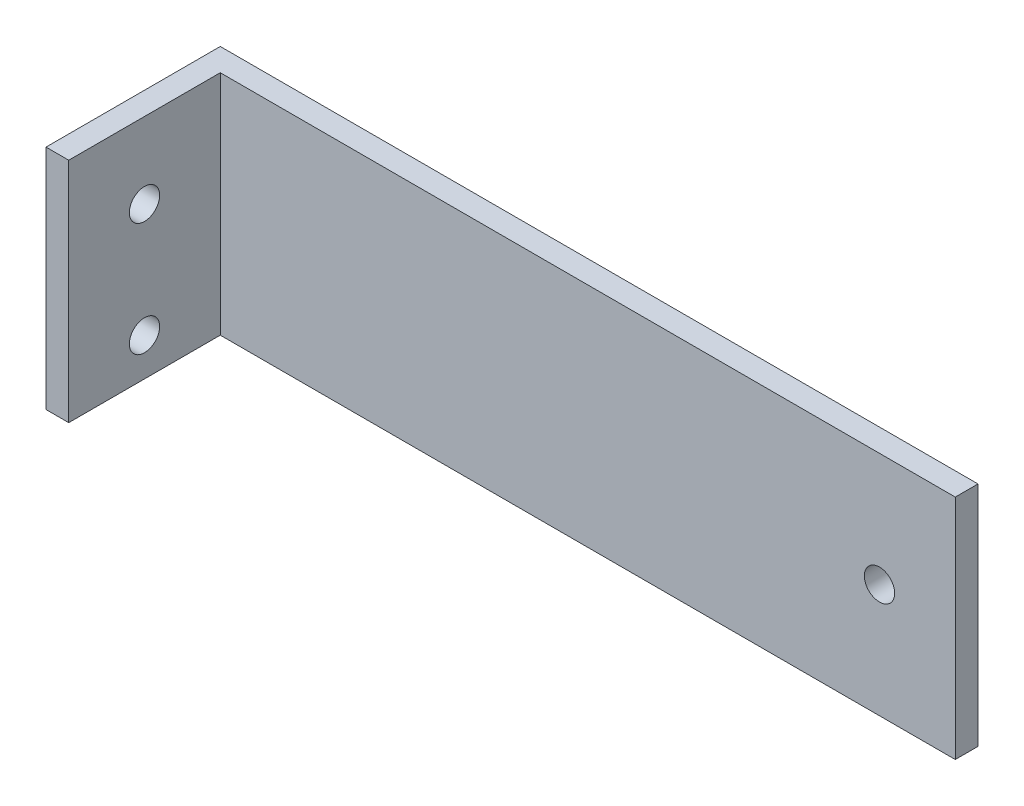
ISO-10303-21;
HEADER;
FILE_DESCRIPTION(('STEP AP214'),'2;1');
FILE_NAME('part.step','',(''),(''),'','','');
FILE_SCHEMA(('AUTOMOTIVE_DESIGN { 1 0 10303 214 1 1 1 1 }'));
ENDSEC;
DATA;
#1=APPLICATION_CONTEXT('core data for automotive mechanical design processes');
#2=APPLICATION_PROTOCOL_DEFINITION('international standard','automotive_design',2000,#1);
#3=PRODUCT_CONTEXT('',#1,'mechanical');
#4=PRODUCT('Part','Part','',(#3));
#5=PRODUCT_RELATED_PRODUCT_CATEGORY('part','',(#4));
#6=PRODUCT_DEFINITION_FORMATION('','',#4);
#7=PRODUCT_DEFINITION_CONTEXT('part definition',#1,'design');
#8=PRODUCT_DEFINITION('design','',#6,#7);
#9=PRODUCT_DEFINITION_SHAPE('','',#8);
#10=(LENGTH_UNIT() NAMED_UNIT(*) SI_UNIT(.MILLI.,.METRE.));
#11=(NAMED_UNIT(*) PLANE_ANGLE_UNIT() SI_UNIT($,.RADIAN.));
#12=(NAMED_UNIT(*) SI_UNIT($,.STERADIAN.) SOLID_ANGLE_UNIT());
#13=UNCERTAINTY_MEASURE_WITH_UNIT(LENGTH_MEASURE(1.E-05),#10,'distance_accuracy_value','');
#14=(GEOMETRIC_REPRESENTATION_CONTEXT(3) GLOBAL_UNCERTAINTY_ASSIGNED_CONTEXT((#13)) GLOBAL_UNIT_ASSIGNED_CONTEXT((#10,
#11,#12)) REPRESENTATION_CONTEXT('',''));
#15=CARTESIAN_POINT('',(0.,0.,0.));
#16=DIRECTION('',(0.,0.,1.));
#17=DIRECTION('',(1.,0.,0.));
#18=AXIS2_PLACEMENT_3D('',#15,#16,#17);
#19=CARTESIAN_POINT('',(50.,15.,3.));
#20=DIRECTION('',(-1.,0.,0.));
#21=DIRECTION('',(0.,0.,1.));
#22=AXIS2_PLACEMENT_3D('',#19,#20,#21);
#23=PLANE('',#22);
#24=DIRECTION('',(0.,1.,0.));
#25=VECTOR('',#24,1.);
#26=CARTESIAN_POINT('',(50.,15.,0.));
#27=LINE('',#26,#25);
#28=CARTESIAN_POINT('',(50.,-15.,0.));
#29=VERTEX_POINT('',#28);
#30=CARTESIAN_POINT('',(50.,15.,0.));
#31=VERTEX_POINT('',#30);
#32=EDGE_CURVE('E94',#29,#31,#27,.T.);
#33=ORIENTED_EDGE('',*,*,#32,.T.);
#34=DIRECTION('',(0.,0.,-1.));
#35=VECTOR('',#34,1.);
#36=CARTESIAN_POINT('',(50.,15.,3.));
#37=LINE('',#36,#35);
#38=CARTESIAN_POINT('',(50.,15.,3.));
#39=VERTEX_POINT('',#38);
#40=EDGE_CURVE('E11',#39,#31,#37,.T.);
#41=ORIENTED_EDGE('',*,*,#40,.F.);
#42=DIRECTION('',(0.,1.,0.));
#43=VECTOR('',#42,1.);
#44=CARTESIAN_POINT('',(50.,15.,3.));
#45=LINE('',#44,#43);
#46=CARTESIAN_POINT('',(50.,-15.,3.));
#47=VERTEX_POINT('',#46);
#48=EDGE_CURVE('E88',#47,#39,#45,.T.);
#49=ORIENTED_EDGE('',*,*,#48,.F.);
#50=DIRECTION('',(0.,0.,-1.));
#51=VECTOR('',#50,1.);
#52=CARTESIAN_POINT('',(50.,-15.,3.));
#53=LINE('',#52,#51);
#54=EDGE_CURVE('E80',#47,#29,#53,.T.);
#55=ORIENTED_EDGE('',*,*,#54,.T.);
#56=EDGE_LOOP('',(#33,#41,#49,#55));
#57=FACE_BOUND('',#56,.T.);
#58=ADVANCED_FACE('F36',(#57),#23,.F.);
#59=CARTESIAN_POINT('',(-50.,15.,3.));
#60=DIRECTION('',(0.,-1.,0.));
#61=DIRECTION('',(0.,0.,-1.));
#62=AXIS2_PLACEMENT_3D('',#59,#60,#61);
#63=PLANE('',#62);
#64=DIRECTION('',(-1.,0.,0.));
#65=VECTOR('',#64,1.);
#66=CARTESIAN_POINT('',(-50.,15.,0.));
#67=LINE('',#66,#65);
#68=CARTESIAN_POINT('',(-50.,15.,0.));
#69=VERTEX_POINT('',#68);
#70=EDGE_CURVE('E97',#31,#69,#67,.T.);
#71=ORIENTED_EDGE('',*,*,#70,.T.);
#72=DIRECTION('',(0.,0.,-1.));
#73=VECTOR('',#72,1.);
#74=CARTESIAN_POINT('',(-50.,15.,3.));
#75=LINE('',#74,#73);
#76=CARTESIAN_POINT('',(-50.,15.,23.));
#77=VERTEX_POINT('',#76);
#78=EDGE_CURVE('E44',#77,#69,#75,.T.);
#79=ORIENTED_EDGE('',*,*,#78,.F.);
#80=DIRECTION('',(-1.,0.,0.));
#81=VECTOR('',#80,1.);
#82=CARTESIAN_POINT('',(-50.,15.,23.));
#83=LINE('',#82,#81);
#84=CARTESIAN_POINT('',(-47.,15.,23.));
#85=VERTEX_POINT('',#84);
#86=EDGE_CURVE('E136',#85,#77,#83,.T.);
#87=ORIENTED_EDGE('',*,*,#86,.F.);
#88=DIRECTION('',(0.,0.,-1.));
#89=VECTOR('',#88,1.);
#90=CARTESIAN_POINT('',(-47.,15.,23.));
#91=LINE('',#90,#89);
#92=CARTESIAN_POINT('',(-47.,15.,3.));
#93=VERTEX_POINT('',#92);
#94=EDGE_CURVE('E102',#85,#93,#91,.T.);
#95=ORIENTED_EDGE('',*,*,#94,.T.);
#96=DIRECTION('',(-1.,0.,0.));
#97=VECTOR('',#96,1.);
#98=CARTESIAN_POINT('',(-50.,15.,3.));
#99=LINE('',#98,#97);
#100=EDGE_CURVE('E142',#39,#93,#99,.T.);
#101=ORIENTED_EDGE('',*,*,#100,.F.);
#102=ORIENTED_EDGE('',*,*,#40,.T.);
#103=EDGE_LOOP('',(#71,#79,#87,#95,#101,#102));
#104=FACE_BOUND('',#103,.T.);
#105=ADVANCED_FACE('F154',(#104),#63,.F.);
#106=CARTESIAN_POINT('',(-50.,15.,3.));
#107=DIRECTION('',(1.,0.,0.));
#108=DIRECTION('',(0.,1.,0.));
#109=AXIS2_PLACEMENT_3D('',#106,#107,#108);
#110=PLANE('',#109);
#111=CARTESIAN_POINT('',(-50.,4.99999999999999,13.));
#112=DIRECTION('',(-1.,0.,0.));
#113=DIRECTION('',(0.,0.,1.));
#114=AXIS2_PLACEMENT_3D('',#111,#112,#113);
#115=CIRCLE('',#114,2.);
#116=CARTESIAN_POINT('',(-50.,4.99999999999999,15.));
#117=VERTEX_POINT('',#116);
#118=EDGE_CURVE('E112',#117,#117,#115,.T.);
#119=ORIENTED_EDGE('',*,*,#118,.F.);
#120=EDGE_LOOP('',(#119));
#121=FACE_BOUND('',#120,.T.);
#122=CARTESIAN_POINT('',(-50.,-10.,13.));
#123=DIRECTION('',(-1.,0.,0.));
#124=DIRECTION('',(0.,0.,1.));
#125=AXIS2_PLACEMENT_3D('',#122,#123,#124);
#126=CIRCLE('',#125,2.);
#127=CARTESIAN_POINT('',(-50.,-10.,15.));
#128=VERTEX_POINT('',#127);
#129=EDGE_CURVE('E117',#128,#128,#126,.T.);
#130=ORIENTED_EDGE('',*,*,#129,.F.);
#131=EDGE_LOOP('',(#130));
#132=FACE_BOUND('',#131,.T.);
#133=DIRECTION('',(0.,-1.,0.));
#134=VECTOR('',#133,1.);
#135=CARTESIAN_POINT('',(-50.,15.,0.));
#136=LINE('',#135,#134);
#137=CARTESIAN_POINT('',(-50.,-15.,0.));
#138=VERTEX_POINT('',#137);
#139=EDGE_CURVE('E89',#69,#138,#136,.T.);
#140=ORIENTED_EDGE('',*,*,#139,.T.);
#141=DIRECTION('',(0.,0.,-1.));
#142=VECTOR('',#141,1.);
#143=CARTESIAN_POINT('',(-50.,-15.,3.));
#144=LINE('',#143,#142);
#145=CARTESIAN_POINT('',(-50.,-15.,23.));
#146=VERTEX_POINT('',#145);
#147=EDGE_CURVE('E84',#146,#138,#144,.T.);
#148=ORIENTED_EDGE('',*,*,#147,.F.);
#149=DIRECTION('',(0.,-1.,0.));
#150=VECTOR('',#149,1.);
#151=CARTESIAN_POINT('',(-50.,15.,23.));
#152=LINE('',#151,#150);
#153=EDGE_CURVE('E127',#77,#146,#152,.T.);
#154=ORIENTED_EDGE('',*,*,#153,.F.);
#155=ORIENTED_EDGE('',*,*,#78,.T.);
#156=EDGE_LOOP('',(#140,#148,#154,#155));
#157=FACE_BOUND('',#156,.T.);
#158=ADVANCED_FACE('F163',(#121,#132,#157),#110,.F.);
#159=CARTESIAN_POINT('',(-50.,-15.,3.));
#160=DIRECTION('',(0.,1.,0.));
#161=DIRECTION('',(0.,0.,1.));
#162=AXIS2_PLACEMENT_3D('',#159,#160,#161);
#163=PLANE('',#162);
#164=DIRECTION('',(1.,0.,0.));
#165=VECTOR('',#164,1.);
#166=CARTESIAN_POINT('',(-50.,-15.,0.));
#167=LINE('',#166,#165);
#168=EDGE_CURVE('E77',#138,#29,#167,.T.);
#169=ORIENTED_EDGE('',*,*,#168,.T.);
#170=ORIENTED_EDGE('',*,*,#54,.F.);
#171=DIRECTION('',(1.,0.,0.));
#172=VECTOR('',#171,1.);
#173=CARTESIAN_POINT('',(-50.,-15.,3.));
#174=LINE('',#173,#172);
#175=CARTESIAN_POINT('',(-47.,-15.,3.));
#176=VERTEX_POINT('',#175);
#177=EDGE_CURVE('E57',#176,#47,#174,.T.);
#178=ORIENTED_EDGE('',*,*,#177,.F.);
#179=DIRECTION('',(0.,0.,-1.));
#180=VECTOR('',#179,1.);
#181=CARTESIAN_POINT('',(-47.,-15.,23.));
#182=LINE('',#181,#180);
#183=CARTESIAN_POINT('',(-47.,-15.,23.));
#184=VERTEX_POINT('',#183);
#185=EDGE_CURVE('E98',#184,#176,#182,.T.);
#186=ORIENTED_EDGE('',*,*,#185,.F.);
#187=DIRECTION('',(1.,0.,0.));
#188=VECTOR('',#187,1.);
#189=CARTESIAN_POINT('',(-50.,-15.,23.));
#190=LINE('',#189,#188);
#191=EDGE_CURVE('E130',#146,#184,#190,.T.);
#192=ORIENTED_EDGE('',*,*,#191,.F.);
#193=ORIENTED_EDGE('',*,*,#147,.T.);
#194=EDGE_LOOP('',(#169,#170,#178,#186,#192,#193));
#195=FACE_BOUND('',#194,.T.);
#196=ADVANCED_FACE('F79',(#195),#163,.F.);
#197=CARTESIAN_POINT('',(0.,0.,3.));
#198=DIRECTION('',(0.,0.,1.));
#199=DIRECTION('',(1.,0.,0.));
#200=AXIS2_PLACEMENT_3D('',#197,#198,#199);
#201=PLANE('',#200);
#202=CARTESIAN_POINT('',(40.,0.,3.));
#203=DIRECTION('',(0.,0.,1.));
#204=DIRECTION('',(1.,0.,0.));
#205=AXIS2_PLACEMENT_3D('',#202,#203,#204);
#206=CIRCLE('',#205,2.);
#207=CARTESIAN_POINT('',(42.,0.,3.));
#208=VERTEX_POINT('',#207);
#209=EDGE_CURVE('E122',#208,#208,#206,.T.);
#210=ORIENTED_EDGE('',*,*,#209,.F.);
#211=EDGE_LOOP('',(#210));
#212=FACE_BOUND('',#211,.T.);
#213=DIRECTION('',(0.,1.,0.));
#214=VECTOR('',#213,1.);
#215=CARTESIAN_POINT('',(-47.,15.,3.));
#216=LINE('',#215,#214);
#217=EDGE_CURVE('E52',#176,#93,#216,.T.);
#218=ORIENTED_EDGE('',*,*,#217,.F.);
#219=ORIENTED_EDGE('',*,*,#177,.T.);
#220=ORIENTED_EDGE('',*,*,#48,.T.);
#221=ORIENTED_EDGE('',*,*,#100,.T.);
#222=EDGE_LOOP('',(#218,#219,#220,#221));
#223=FACE_BOUND('',#222,.T.);
#224=ADVANCED_FACE('F144',(#212,#223),#201,.T.);
#225=CARTESIAN_POINT('',(0.,0.,0.));
#226=DIRECTION('',(0.,0.,1.));
#227=DIRECTION('',(1.,0.,0.));
#228=AXIS2_PLACEMENT_3D('',#225,#226,#227);
#229=PLANE('',#228);
#230=CARTESIAN_POINT('',(40.,0.,0.));
#231=DIRECTION('',(0.,0.,-1.));
#232=DIRECTION('',(-1.,0.,0.));
#233=AXIS2_PLACEMENT_3D('',#230,#231,#232);
#234=CIRCLE('',#233,2.);
#235=CARTESIAN_POINT('',(38.,0.,0.));
#236=VERTEX_POINT('',#235);
#237=EDGE_CURVE('E264',#236,#236,#234,.T.);
#238=ORIENTED_EDGE('',*,*,#237,.F.);
#239=EDGE_LOOP('',(#238));
#240=FACE_BOUND('',#239,.T.);
#241=ORIENTED_EDGE('',*,*,#32,.F.);
#242=ORIENTED_EDGE('',*,*,#168,.F.);
#243=ORIENTED_EDGE('',*,*,#139,.F.);
#244=ORIENTED_EDGE('',*,*,#70,.F.);
#245=EDGE_LOOP('',(#241,#242,#243,#244));
#246=FACE_BOUND('',#245,.T.);
#247=ADVANCED_FACE('F96',(#240,#246),#229,.F.);
#248=CARTESIAN_POINT('',(-47.,15.,23.));
#249=DIRECTION('',(-1.,0.,0.));
#250=DIRECTION('',(0.,0.,1.));
#251=AXIS2_PLACEMENT_3D('',#248,#249,#250);
#252=PLANE('',#251);
#253=CARTESIAN_POINT('',(-47.,4.99999999999999,13.));
#254=DIRECTION('',(-1.,0.,0.));
#255=DIRECTION('',(0.,0.,1.));
#256=AXIS2_PLACEMENT_3D('',#253,#254,#255);
#257=CIRCLE('',#256,2.);
#258=CARTESIAN_POINT('',(-47.,4.99999999999999,15.));
#259=VERTEX_POINT('',#258);
#260=EDGE_CURVE('E39',#259,#259,#257,.T.);
#261=ORIENTED_EDGE('',*,*,#260,.T.);
#262=EDGE_LOOP('',(#261));
#263=FACE_BOUND('',#262,.T.);
#264=CARTESIAN_POINT('',(-47.,-10.,13.));
#265=DIRECTION('',(-1.,0.,0.));
#266=DIRECTION('',(0.,0.,1.));
#267=AXIS2_PLACEMENT_3D('',#264,#265,#266);
#268=CIRCLE('',#267,2.);
#269=CARTESIAN_POINT('',(-47.,-10.,15.));
#270=VERTEX_POINT('',#269);
#271=EDGE_CURVE('E110',#270,#270,#268,.T.);
#272=ORIENTED_EDGE('',*,*,#271,.T.);
#273=EDGE_LOOP('',(#272));
#274=FACE_BOUND('',#273,.T.);
#275=ORIENTED_EDGE('',*,*,#217,.T.);
#276=ORIENTED_EDGE('',*,*,#94,.F.);
#277=DIRECTION('',(0.,1.,0.));
#278=VECTOR('',#277,1.);
#279=CARTESIAN_POINT('',(-47.,15.,23.));
#280=LINE('',#279,#278);
#281=EDGE_CURVE('E133',#184,#85,#280,.T.);
#282=ORIENTED_EDGE('',*,*,#281,.F.);
#283=ORIENTED_EDGE('',*,*,#185,.T.);
#284=EDGE_LOOP('',(#275,#276,#282,#283));
#285=FACE_BOUND('',#284,.T.);
#286=ADVANCED_FACE('F149',(#263,#274,#285),#252,.F.);
#287=CARTESIAN_POINT('',(0.,0.,23.));
#288=DIRECTION('',(0.,0.,1.));
#289=DIRECTION('',(1.,0.,0.));
#290=AXIS2_PLACEMENT_3D('',#287,#288,#289);
#291=PLANE('',#290);
#292=ORIENTED_EDGE('',*,*,#153,.T.);
#293=ORIENTED_EDGE('',*,*,#191,.T.);
#294=ORIENTED_EDGE('',*,*,#281,.T.);
#295=ORIENTED_EDGE('',*,*,#86,.T.);
#296=EDGE_LOOP('',(#292,#293,#294,#295));
#297=FACE_BOUND('',#296,.T.);
#298=ADVANCED_FACE('F160',(#297),#291,.T.);
#299=CARTESIAN_POINT('',(50.,-10.,13.));
#300=DIRECTION('',(-1.,0.,0.));
#301=DIRECTION('',(0.,0.,1.));
#302=AXIS2_PLACEMENT_3D('',#299,#300,#301);
#303=CYLINDRICAL_SURFACE('',#302,2.);
#304=ORIENTED_EDGE('',*,*,#129,.T.);
#305=EDGE_LOOP('',(#304));
#306=FACE_BOUND('',#305,.T.);
#307=ORIENTED_EDGE('',*,*,#271,.F.);
#308=EDGE_LOOP('',(#307));
#309=FACE_BOUND('',#308,.T.);
#310=ADVANCED_FACE('F202',(#306,#309),#303,.F.);
#311=CARTESIAN_POINT('',(50.,4.99999999999999,13.));
#312=DIRECTION('',(-1.,0.,0.));
#313=DIRECTION('',(0.,0.,1.));
#314=AXIS2_PLACEMENT_3D('',#311,#312,#313);
#315=CYLINDRICAL_SURFACE('',#314,2.);
#316=ORIENTED_EDGE('',*,*,#118,.T.);
#317=EDGE_LOOP('',(#316));
#318=FACE_BOUND('',#317,.T.);
#319=ORIENTED_EDGE('',*,*,#260,.F.);
#320=EDGE_LOOP('',(#319));
#321=FACE_BOUND('',#320,.T.);
#322=ADVANCED_FACE('F225',(#318,#321),#315,.F.);
#323=CARTESIAN_POINT('',(40.,0.,10.));
#324=DIRECTION('',(0.,0.,-1.));
#325=DIRECTION('',(-1.,0.,0.));
#326=AXIS2_PLACEMENT_3D('',#323,#324,#325);
#327=CYLINDRICAL_SURFACE('',#326,2.);
#328=ORIENTED_EDGE('',*,*,#209,.T.);
#329=EDGE_LOOP('',(#328));
#330=FACE_BOUND('',#329,.T.);
#331=ORIENTED_EDGE('',*,*,#237,.T.);
#332=EDGE_LOOP('',(#331));
#333=FACE_BOUND('',#332,.T.);
#334=ADVANCED_FACE('F235',(#330,#333),#327,.F.);
#335=CLOSED_SHELL('',(#58,#105,#158,#196,#224,#247,#286,#298,#310,#322,#334));
#336=MANIFOLD_SOLID_BREP('B2',#335);
#337=ADVANCED_BREP_SHAPE_REPRESENTATION('',(#18,#336),#14);
#338=SHAPE_DEFINITION_REPRESENTATION(#9,#337);
ENDSEC;
END-ISO-10303-21;
